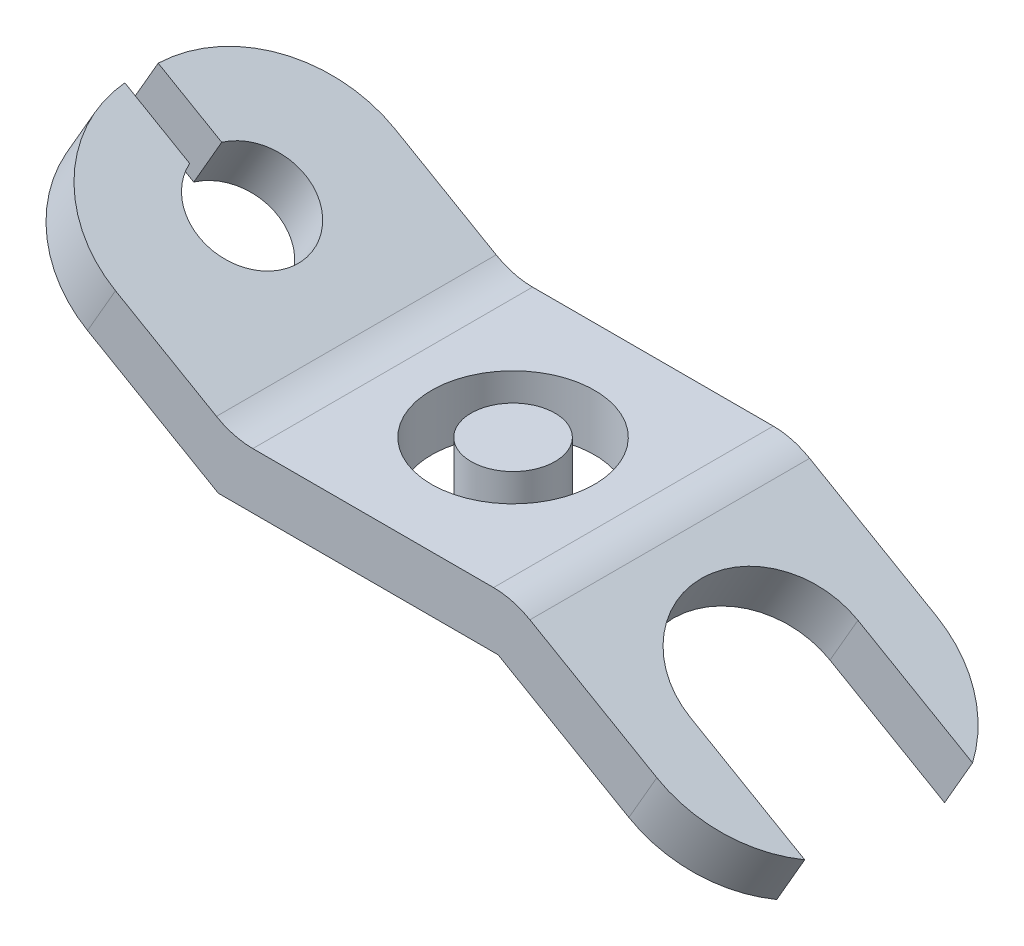
ISO-10303-21;
HEADER;
FILE_DESCRIPTION(('STEP AP214'),'2;1');
FILE_NAME('part.step','',(''),(''),'','','');
FILE_SCHEMA(('AUTOMOTIVE_DESIGN { 1 0 10303 214 1 1 1 1 }'));
ENDSEC;
DATA;
#1=APPLICATION_CONTEXT('core data for automotive mechanical design processes');
#2=APPLICATION_PROTOCOL_DEFINITION('international standard','automotive_design',2000,#1);
#3=PRODUCT_CONTEXT('',#1,'mechanical');
#4=PRODUCT('Part','Part','',(#3));
#5=PRODUCT_RELATED_PRODUCT_CATEGORY('part','',(#4));
#6=PRODUCT_DEFINITION_FORMATION('','',#4);
#7=PRODUCT_DEFINITION_CONTEXT('part definition',#1,'design');
#8=PRODUCT_DEFINITION('design','',#6,#7);
#9=PRODUCT_DEFINITION_SHAPE('','',#8);
#10=(LENGTH_UNIT() NAMED_UNIT(*) SI_UNIT(.MILLI.,.METRE.));
#11=(NAMED_UNIT(*) PLANE_ANGLE_UNIT() SI_UNIT($,.RADIAN.));
#12=(NAMED_UNIT(*) SI_UNIT($,.STERADIAN.) SOLID_ANGLE_UNIT());
#13=UNCERTAINTY_MEASURE_WITH_UNIT(LENGTH_MEASURE(1.E-05),#10,'distance_accuracy_value','');
#14=(GEOMETRIC_REPRESENTATION_CONTEXT(3) GLOBAL_UNCERTAINTY_ASSIGNED_CONTEXT((#13)) GLOBAL_UNIT_ASSIGNED_CONTEXT((#10,
#11,#12)) REPRESENTATION_CONTEXT('',''));
#15=CARTESIAN_POINT('',(0.,0.,0.));
#16=DIRECTION('',(0.,0.,1.));
#17=DIRECTION('',(1.,0.,0.));
#18=AXIS2_PLACEMENT_3D('',#15,#16,#17);
#19=CARTESIAN_POINT('',(4.99999999999995,8.66025403784442,50.));
#20=DIRECTION('',(-0.499999999999995,-0.866025403784442,0.));
#21=DIRECTION('',(0.866025403784442,-0.499999999999995,0.));
#22=AXIS2_PLACEMENT_3D('',#19,#20,#21);
#23=PLANE('',#22);
#24=DIRECTION('',(-0.866025403784442,0.499999999999995,0.));
#25=VECTOR('',#24,1.);
#26=CARTESIAN_POINT('',(4.99999999999995,8.66025403784442,50.));
#27=LINE('',#26,#25);
#28=CARTESIAN_POINT('',(-0.337168574084188,11.7416697508023,50.));
#29=VERTEX_POINT('',#28);
#30=CARTESIAN_POINT('',(-18.38268590218,22.1602540378443,50.));
#31=VERTEX_POINT('',#30);
#32=EDGE_CURVE('E250',#29,#31,#27,.T.);
#33=ORIENTED_EDGE('',*,*,#32,.F.);
#34=DIRECTION('',(0.,0.,-1.));
#35=VECTOR('',#34,1.);
#36=CARTESIAN_POINT('',(-0.337168574084185,11.7416697508023,0.));
#37=LINE('',#36,#35);
#38=CARTESIAN_POINT('',(-0.337168574084188,11.7416697508023,0.));
#39=VERTEX_POINT('',#38);
#40=EDGE_CURVE('E385',#29,#39,#37,.T.);
#41=ORIENTED_EDGE('',*,*,#40,.T.);
#42=DIRECTION('',(-0.866025403784442,0.499999999999995,0.));
#43=VECTOR('',#42,1.);
#44=CARTESIAN_POINT('',(4.99999999999995,8.66025403784442,0.));
#45=LINE('',#44,#43);
#46=CARTESIAN_POINT('',(-18.38268590218,22.1602540378443,0.));
#47=VERTEX_POINT('',#46);
#48=EDGE_CURVE('E265',#39,#47,#45,.T.);
#49=ORIENTED_EDGE('',*,*,#48,.T.);
#50=CARTESIAN_POINT('',(-18.38268590218,22.1602540378443,23.));
#51=DIRECTION('',(-0.499999999999995,-0.866025403784442,0.));
#52=DIRECTION('',(0.866025403784442,-0.499999999999995,0.));
#53=AXIS2_PLACEMENT_3D('',#50,#51,#52);
#54=CIRCLE('',#53,23.);
#55=CARTESIAN_POINT('',(-38.295692303261,33.657033643883,22.4557254730551));
#56=VERTEX_POINT('',#55);
#57=EDGE_CURVE('E261',#47,#56,#54,.F.);
#58=ORIENTED_EDGE('',*,*,#57,.T.);
#59=DIRECTION('',(-0.866025403784442,0.499999999999995,0.));
#60=VECTOR('',#59,1.);
#61=CARTESIAN_POINT('',(4.99999999999995,8.66025403784441,22.4557254730551));
#62=LINE('',#61,#60);
#63=CARTESIAN_POINT('',(-26.9356186363038,27.0982920542514,22.4557254730551));
#64=VERTEX_POINT('',#63);
#65=EDGE_CURVE('E321',#64,#56,#62,.T.);
#66=ORIENTED_EDGE('',*,*,#65,.F.);
#67=CARTESIAN_POINT('',(-18.9711431702999,22.4999999999999,25.));
#68=DIRECTION('',(0.499999999999995,0.866025403784442,0.));
#69=DIRECTION('',(-0.866025403784442,0.499999999999995,0.));
#70=AXIS2_PLACEMENT_3D('',#67,#68,#69);
#71=CIRCLE('',#70,9.54203815404409);
#72=CARTESIAN_POINT('',(-26.6738271305233,26.9471466579174,28.4557254730551));
#73=VERTEX_POINT('',#72);
#74=EDGE_CURVE('E316',#73,#64,#71,.T.);
#75=ORIENTED_EDGE('',*,*,#74,.F.);
#76=DIRECTION('',(-0.866025403784442,0.499999999999995,0.));
#77=VECTOR('',#76,1.);
#78=CARTESIAN_POINT('',(4.99999999999995,8.66025403784441,28.4557254730551));
#79=LINE('',#78,#77);
#80=CARTESIAN_POINT('',(-38.2613339324241,33.6371968292314,28.4557254730551));
#81=VERTEX_POINT('',#80);
#82=EDGE_CURVE('E270',#73,#81,#79,.T.);
#83=ORIENTED_EDGE('',*,*,#82,.T.);
#84=CARTESIAN_POINT('',(-18.38268590218,22.1602540378443,27.));
#85=DIRECTION('',(-0.499999999999995,-0.866025403784442,0.));
#86=DIRECTION('',(0.866025403784442,-0.499999999999995,0.));
#87=AXIS2_PLACEMENT_3D('',#84,#85,#86);
#88=CIRCLE('',#87,23.);
#89=EDGE_CURVE('E266',#81,#31,#88,.F.);
#90=ORIENTED_EDGE('',*,*,#89,.T.);
#91=EDGE_LOOP('',(#33,#41,#49,#58,#66,#75,#83,#90));
#92=FACE_BOUND('',#91,.T.);
#93=ADVANCED_FACE('F68',(#92),#23,.F.);
#94=CARTESIAN_POINT('',(0.,0.,50.));
#95=DIRECTION('',(-0.499999999999995,-0.866025403784442,0.));
#96=DIRECTION('',(0.866025403784442,-0.499999999999995,0.));
#97=AXIS2_PLACEMENT_3D('',#94,#95,#96);
#98=PLANE('',#97);
#99=CARTESIAN_POINT('',(-23.3826859021799,13.4999999999999,27.));
#100=DIRECTION('',(-0.499999999999995,-0.866025403784442,0.));
#101=DIRECTION('',(0.866025403784442,-0.499999999999995,0.));
#102=AXIS2_PLACEMENT_3D('',#99,#100,#101);
#103=CIRCLE('',#102,23.);
#104=CARTESIAN_POINT('',(-23.3826859021799,13.4999999999999,50.));
#105=VERTEX_POINT('',#104);
#106=CARTESIAN_POINT('',(-43.261333932424,24.9769427913869,28.4557254730551));
#107=VERTEX_POINT('',#106);
#108=EDGE_CURVE('E256',#105,#107,#103,.T.);
#109=ORIENTED_EDGE('',*,*,#108,.T.);
#110=DIRECTION('',(-0.866025403784442,0.499999999999995,0.));
#111=VECTOR('',#110,1.);
#112=CARTESIAN_POINT('',(0.,0.,28.4557254730551));
#113=LINE('',#112,#111);
#114=CARTESIAN_POINT('',(-31.6738271305233,18.286892620073,28.4557254730551));
#115=VERTEX_POINT('',#114);
#116=EDGE_CURVE('E315',#115,#107,#113,.T.);
#117=ORIENTED_EDGE('',*,*,#116,.F.);
#118=CARTESIAN_POINT('',(-23.9711431702998,13.8397459621554,25.));
#119=DIRECTION('',(0.499999999999995,0.866025403784442,0.));
#120=DIRECTION('',(-0.866025403784442,0.499999999999995,0.));
#121=AXIS2_PLACEMENT_3D('',#118,#119,#120);
#122=CIRCLE('',#121,9.54203815404409);
#123=CARTESIAN_POINT('',(-31.9356186363038,18.438038016407,22.4557254730551));
#124=VERTEX_POINT('',#123);
#125=EDGE_CURVE('E260',#115,#124,#122,.T.);
#126=ORIENTED_EDGE('',*,*,#125,.T.);
#127=DIRECTION('',(-0.866025403784442,0.499999999999995,0.));
#128=VECTOR('',#127,1.);
#129=CARTESIAN_POINT('',(0.,0.,22.4557254730551));
#130=LINE('',#129,#128);
#131=CARTESIAN_POINT('',(-43.2956923032609,24.9967796060385,22.4557254730551));
#132=VERTEX_POINT('',#131);
#133=EDGE_CURVE('E255',#124,#132,#130,.T.);
#134=ORIENTED_EDGE('',*,*,#133,.T.);
#135=CARTESIAN_POINT('',(-23.3826859021799,13.4999999999999,23.));
#136=DIRECTION('',(-0.499999999999995,-0.866025403784442,0.));
#137=DIRECTION('',(0.866025403784442,-0.499999999999995,0.));
#138=AXIS2_PLACEMENT_3D('',#135,#136,#137);
#139=CIRCLE('',#138,23.);
#140=CARTESIAN_POINT('',(-23.3826859021799,13.4999999999999,0.));
#141=VERTEX_POINT('',#140);
#142=EDGE_CURVE('E251',#132,#141,#139,.T.);
#143=ORIENTED_EDGE('',*,*,#142,.T.);
#144=DIRECTION('',(-0.866025403784442,0.499999999999995,0.));
#145=VECTOR('',#144,1.);
#146=CARTESIAN_POINT('',(0.,0.,0.));
#147=LINE('',#146,#145);
#148=CARTESIAN_POINT('',(0.,0.,0.));
#149=VERTEX_POINT('',#148);
#150=EDGE_CURVE('E276',#149,#141,#147,.T.);
#151=ORIENTED_EDGE('',*,*,#150,.F.);
#152=DIRECTION('',(0.,0.,-1.));
#153=VECTOR('',#152,1.);
#154=CARTESIAN_POINT('',(0.,0.,50.));
#155=LINE('',#154,#153);
#156=CARTESIAN_POINT('',(0.,0.,50.));
#157=VERTEX_POINT('',#156);
#158=EDGE_CURVE('E277',#157,#149,#155,.T.);
#159=ORIENTED_EDGE('',*,*,#158,.F.);
#160=DIRECTION('',(-0.866025403784442,0.499999999999995,0.));
#161=VECTOR('',#160,1.);
#162=CARTESIAN_POINT('',(0.,0.,50.));
#163=LINE('',#162,#161);
#164=EDGE_CURVE('E254',#157,#105,#163,.T.);
#165=ORIENTED_EDGE('',*,*,#164,.T.);
#166=EDGE_LOOP('',(#109,#117,#126,#134,#143,#151,#159,#165));
#167=FACE_BOUND('',#166,.T.);
#168=ADVANCED_FACE('F410',(#167),#98,.T.);
#169=CARTESIAN_POINT('',(-23.3826859021799,13.4999999999999,27.));
#170=DIRECTION('',(-0.499999999999994,-0.866025403784442,0.));
#171=DIRECTION('',(0.866025403784442,-0.499999999999994,0.));
#172=AXIS2_PLACEMENT_3D('',#169,#170,#171);
#173=CYLINDRICAL_SURFACE('',#172,23.);
#174=ORIENTED_EDGE('',*,*,#89,.F.);
#175=DIRECTION('',(0.499999999999995,0.866025403784442,0.));
#176=VECTOR('',#175,1.);
#177=CARTESIAN_POINT('',(-43.261333932424,24.9769427913869,28.4557254730551));
#178=LINE('',#177,#176);
#179=EDGE_CURVE('E325',#107,#81,#178,.T.);
#180=ORIENTED_EDGE('',*,*,#179,.F.);
#181=ORIENTED_EDGE('',*,*,#108,.F.);
#182=DIRECTION('',(0.499999999999994,0.866025403784442,0.));
#183=VECTOR('',#182,1.);
#184=CARTESIAN_POINT('',(-23.3826859021799,13.4999999999999,50.));
#185=LINE('',#184,#183);
#186=EDGE_CURVE('E247',#31,#105,#185,.F.);
#187=ORIENTED_EDGE('',*,*,#186,.F.);
#188=EDGE_LOOP('',(#174,#180,#181,#187));
#189=FACE_BOUND('',#188,.T.);
#190=ADVANCED_FACE('F414',(#189),#173,.T.);
#191=CARTESIAN_POINT('',(0.,0.,50.));
#192=DIRECTION('',(0.,-1.,0.));
#193=DIRECTION('',(0.,0.,-1.));
#194=AXIS2_PLACEMENT_3D('',#191,#192,#193);
#195=PLANE('',#194);
#196=CARTESIAN_POINT('',(27.6794919243112,0.,25.));
#197=DIRECTION('',(0.,1.,0.));
#198=DIRECTION('',(0.,0.,1.));
#199=AXIS2_PLACEMENT_3D('',#196,#197,#198);
#200=CIRCLE('',#199,14.5725064696315);
#201=CARTESIAN_POINT('',(27.6794919243112,0.,39.5725064696315));
#202=VERTEX_POINT('',#201);
#203=EDGE_CURVE('E306',#202,#202,#200,.T.);
#204=ORIENTED_EDGE('',*,*,#203,.T.);
#205=EDGE_LOOP('',(#204));
#206=FACE_BOUND('',#205,.T.);
#207=DIRECTION('',(-1.,0.,0.));
#208=VECTOR('',#207,1.);
#209=CARTESIAN_POINT('',(0.,0.,0.));
#210=LINE('',#209,#208);
#211=CARTESIAN_POINT('',(50.,0.,0.));
#212=VERTEX_POINT('',#211);
#213=EDGE_CURVE('E287',#212,#149,#210,.T.);
#214=ORIENTED_EDGE('',*,*,#213,.F.);
#215=DIRECTION('',(0.,0.,-1.));
#216=VECTOR('',#215,1.);
#217=CARTESIAN_POINT('',(50.,0.,50.));
#218=LINE('',#217,#216);
#219=CARTESIAN_POINT('',(50.,0.,50.));
#220=VERTEX_POINT('',#219);
#221=EDGE_CURVE('E237',#220,#212,#218,.T.);
#222=ORIENTED_EDGE('',*,*,#221,.F.);
#223=DIRECTION('',(-1.,0.,0.));
#224=VECTOR('',#223,1.);
#225=CARTESIAN_POINT('',(0.,0.,50.));
#226=LINE('',#225,#224);
#227=EDGE_CURVE('E281',#220,#157,#226,.T.);
#228=ORIENTED_EDGE('',*,*,#227,.T.);
#229=ORIENTED_EDGE('',*,*,#158,.T.);
#230=EDGE_LOOP('',(#214,#222,#228,#229));
#231=FACE_BOUND('',#230,.T.);
#232=ADVANCED_FACE('F433',(#206,#231),#195,.T.);
#233=CARTESIAN_POINT('',(50.,0.,50.));
#234=DIRECTION('',(-0.500000000000001,-0.866025403784438,0.));
#235=DIRECTION('',(0.866025403784438,-0.500000000000001,0.));
#236=AXIS2_PLACEMENT_3D('',#233,#234,#235);
#237=PLANE('',#236);
#238=DIRECTION('',(-0.866025403784438,0.500000000000001,0.));
#239=VECTOR('',#238,1.);
#240=CARTESIAN_POINT('',(69.3301270189222,-11.1602540378444,10.));
#241=LINE('',#240,#239);
#242=CARTESIAN_POINT('',(89.8143626273348,-22.9868329805052,10.));
#243=VERTEX_POINT('',#242);
#244=CARTESIAN_POINT('',(69.3301270189222,-11.1602540378444,10.));
#245=VERTEX_POINT('',#244);
#246=EDGE_CURVE('E280',#243,#245,#241,.T.);
#247=ORIENTED_EDGE('',*,*,#246,.T.);
#248=CARTESIAN_POINT('',(69.3301270189222,-11.1602540378444,25.));
#249=DIRECTION('',(0.500000000000001,0.866025403784438,0.));
#250=DIRECTION('',(-0.866025403784438,0.500000000000001,0.));
#251=AXIS2_PLACEMENT_3D('',#248,#249,#250);
#252=CIRCLE('',#251,15.);
#253=CARTESIAN_POINT('',(69.3301270189222,-11.1602540378444,40.));
#254=VERTEX_POINT('',#253);
#255=EDGE_CURVE('E358',#245,#254,#252,.T.);
#256=ORIENTED_EDGE('',*,*,#255,.T.);
#257=DIRECTION('',(0.866025403784438,-0.500000000000001,0.));
#258=VECTOR('',#257,1.);
#259=CARTESIAN_POINT('',(69.3301270189222,-11.1602540378444,40.));
#260=LINE('',#259,#258);
#261=CARTESIAN_POINT('',(89.8143626273348,-22.9868329805052,40.));
#262=VERTEX_POINT('',#261);
#263=EDGE_CURVE('E241',#254,#262,#260,.T.);
#264=ORIENTED_EDGE('',*,*,#263,.T.);
#265=CARTESIAN_POINT('',(73.3826859021798,-13.5,27.));
#266=DIRECTION('',(-0.500000000000001,-0.866025403784438,0.));
#267=DIRECTION('',(0.866025403784438,-0.500000000000001,0.));
#268=AXIS2_PLACEMENT_3D('',#265,#266,#267);
#269=CIRCLE('',#268,23.);
#270=CARTESIAN_POINT('',(73.3826859021798,-13.5,50.));
#271=VERTEX_POINT('',#270);
#272=EDGE_CURVE('E213',#262,#271,#269,.T.);
#273=ORIENTED_EDGE('',*,*,#272,.T.);
#274=DIRECTION('',(-0.866025403784438,0.500000000000001,0.));
#275=VECTOR('',#274,1.);
#276=CARTESIAN_POINT('',(50.,0.,50.));
#277=LINE('',#276,#275);
#278=EDGE_CURVE('E240',#271,#220,#277,.T.);
#279=ORIENTED_EDGE('',*,*,#278,.T.);
#280=ORIENTED_EDGE('',*,*,#221,.T.);
#281=DIRECTION('',(-0.866025403784438,0.500000000000001,0.));
#282=VECTOR('',#281,1.);
#283=CARTESIAN_POINT('',(50.,0.,0.));
#284=LINE('',#283,#282);
#285=CARTESIAN_POINT('',(73.3826859021798,-13.5,0.));
#286=VERTEX_POINT('',#285);
#287=EDGE_CURVE('E246',#286,#212,#284,.T.);
#288=ORIENTED_EDGE('',*,*,#287,.F.);
#289=CARTESIAN_POINT('',(73.3826859021798,-13.5,23.));
#290=DIRECTION('',(-0.500000000000001,-0.866025403784438,0.));
#291=DIRECTION('',(0.866025403784438,-0.500000000000001,0.));
#292=AXIS2_PLACEMENT_3D('',#289,#290,#291);
#293=CIRCLE('',#292,23.);
#294=EDGE_CURVE('E233',#286,#243,#293,.T.);
#295=ORIENTED_EDGE('',*,*,#294,.T.);
#296=EDGE_LOOP('',(#247,#256,#264,#273,#279,#280,#288,#295));
#297=FACE_BOUND('',#296,.T.);
#298=ADVANCED_FACE('F449',(#297),#237,.T.);
#299=CARTESIAN_POINT('',(55.,8.66025403784438,50.));
#300=DIRECTION('',(-0.500000000000001,-0.866025403784438,0.));
#301=DIRECTION('',(0.866025403784438,-0.500000000000001,0.));
#302=AXIS2_PLACEMENT_3D('',#299,#300,#301);
#303=PLANE('',#302);
#304=DIRECTION('',(-0.866025403784438,0.500000000000001,0.));
#305=VECTOR('',#304,1.);
#306=CARTESIAN_POINT('',(55.,8.66025403784438,0.));
#307=LINE('',#306,#305);
#308=CARTESIAN_POINT('',(78.3826859021799,-4.83974596215566,0.));
#309=VERTEX_POINT('',#308);
#310=CARTESIAN_POINT('',(55.6961524227066,8.25833024919769,0.));
#311=VERTEX_POINT('',#310);
#312=EDGE_CURVE('E221',#309,#311,#307,.T.);
#313=ORIENTED_EDGE('',*,*,#312,.T.);
#314=DIRECTION('',(0.,0.,-1.));
#315=VECTOR('',#314,1.);
#316=CARTESIAN_POINT('',(55.6961524227066,8.25833024919769,50.));
#317=LINE('',#316,#315);
#318=CARTESIAN_POINT('',(55.6961524227066,8.25833024919769,50.));
#319=VERTEX_POINT('',#318);
#320=EDGE_CURVE('E90',#311,#319,#317,.F.);
#321=ORIENTED_EDGE('',*,*,#320,.T.);
#322=DIRECTION('',(-0.866025403784438,0.500000000000001,0.));
#323=VECTOR('',#322,1.);
#324=CARTESIAN_POINT('',(55.,8.66025403784438,50.));
#325=LINE('',#324,#323);
#326=CARTESIAN_POINT('',(78.3826859021799,-4.83974596215567,50.));
#327=VERTEX_POINT('',#326);
#328=EDGE_CURVE('E218',#327,#319,#325,.T.);
#329=ORIENTED_EDGE('',*,*,#328,.F.);
#330=CARTESIAN_POINT('',(78.3826859021799,-4.83974596215566,27.));
#331=DIRECTION('',(-0.500000000000001,-0.866025403784438,0.));
#332=DIRECTION('',(0.866025403784438,-0.500000000000001,0.));
#333=AXIS2_PLACEMENT_3D('',#330,#331,#332);
#334=CIRCLE('',#333,23.);
#335=CARTESIAN_POINT('',(94.8143626273348,-14.3265789426608,40.));
#336=VERTEX_POINT('',#335);
#337=EDGE_CURVE('E212',#327,#336,#334,.F.);
#338=ORIENTED_EDGE('',*,*,#337,.T.);
#339=DIRECTION('',(0.866025403784438,-0.500000000000001,0.));
#340=VECTOR('',#339,1.);
#341=CARTESIAN_POINT('',(74.3301270189222,-2.50000000000001,40.));
#342=LINE('',#341,#340);
#343=CARTESIAN_POINT('',(74.3301270189222,-2.50000000000001,40.));
#344=VERTEX_POINT('',#343);
#345=EDGE_CURVE('E194',#344,#336,#342,.T.);
#346=ORIENTED_EDGE('',*,*,#345,.F.);
#347=CARTESIAN_POINT('',(74.3301270189222,-2.50000000000001,25.));
#348=DIRECTION('',(0.500000000000001,0.866025403784438,0.));
#349=DIRECTION('',(-0.866025403784438,0.500000000000001,0.));
#350=AXIS2_PLACEMENT_3D('',#347,#348,#349);
#351=CIRCLE('',#350,15.);
#352=CARTESIAN_POINT('',(74.3301270189222,-2.50000000000001,10.));
#353=VERTEX_POINT('',#352);
#354=EDGE_CURVE('E320',#353,#344,#351,.T.);
#355=ORIENTED_EDGE('',*,*,#354,.F.);
#356=DIRECTION('',(-0.866025403784438,0.500000000000001,0.));
#357=VECTOR('',#356,1.);
#358=CARTESIAN_POINT('',(74.3301270189222,-2.50000000000001,10.));
#359=LINE('',#358,#357);
#360=CARTESIAN_POINT('',(94.8143626273348,-14.3265789426608,10.));
#361=VERTEX_POINT('',#360);
#362=EDGE_CURVE('E215',#361,#353,#359,.T.);
#363=ORIENTED_EDGE('',*,*,#362,.F.);
#364=CARTESIAN_POINT('',(78.3826859021799,-4.83974596215566,23.));
#365=DIRECTION('',(-0.500000000000001,-0.866025403784438,0.));
#366=DIRECTION('',(0.866025403784438,-0.500000000000001,0.));
#367=AXIS2_PLACEMENT_3D('',#364,#365,#366);
#368=CIRCLE('',#367,23.);
#369=EDGE_CURVE('E228',#361,#309,#368,.F.);
#370=ORIENTED_EDGE('',*,*,#369,.T.);
#371=EDGE_LOOP('',(#313,#321,#329,#338,#346,#355,#363,#370));
#372=FACE_BOUND('',#371,.T.);
#373=ADVANCED_FACE('F217',(#372),#303,.F.);
#374=CARTESIAN_POINT('',(0.,10.,50.));
#375=DIRECTION('',(0.,-1.,0.));
#376=DIRECTION('',(0.,0.,-1.));
#377=AXIS2_PLACEMENT_3D('',#374,#375,#376);
#378=PLANE('',#377);
#379=CARTESIAN_POINT('',(27.6794919243112,10.,25.));
#380=DIRECTION('',(0.,1.,0.));
#381=DIRECTION('',(0.,0.,1.));
#382=AXIS2_PLACEMENT_3D('',#379,#380,#381);
#383=CIRCLE('',#382,14.5725064696315);
#384=CARTESIAN_POINT('',(27.6794919243112,10.,39.5725064696315));
#385=VERTEX_POINT('',#384);
#386=EDGE_CURVE('E205',#385,#385,#383,.T.);
#387=ORIENTED_EDGE('',*,*,#386,.F.);
#388=EDGE_LOOP('',(#387));
#389=FACE_BOUND('',#388,.T.);
#390=DIRECTION('',(1.,0.,0.));
#391=VECTOR('',#390,1.);
#392=CARTESIAN_POINT('',(0.,10.,50.));
#393=LINE('',#392,#391);
#394=CARTESIAN_POINT('',(49.1961524227066,10.,50.));
#395=VERTEX_POINT('',#394);
#396=CARTESIAN_POINT('',(6.16283142591574,10.,50.));
#397=VERTEX_POINT('',#396);
#398=EDGE_CURVE('E296',#395,#397,#393,.F.);
#399=ORIENTED_EDGE('',*,*,#398,.F.);
#400=DIRECTION('',(0.,0.,-1.));
#401=VECTOR('',#400,1.);
#402=CARTESIAN_POINT('',(49.1961524227066,10.,50.));
#403=LINE('',#402,#401);
#404=CARTESIAN_POINT('',(49.1961524227066,10.,0.));
#405=VERTEX_POINT('',#404);
#406=EDGE_CURVE('E373',#395,#405,#403,.T.);
#407=ORIENTED_EDGE('',*,*,#406,.T.);
#408=DIRECTION('',(1.,0.,0.));
#409=VECTOR('',#408,1.);
#410=CARTESIAN_POINT('',(0.,10.,0.));
#411=LINE('',#410,#409);
#412=CARTESIAN_POINT('',(6.16283142591574,10.,0.));
#413=VERTEX_POINT('',#412);
#414=EDGE_CURVE('E220',#405,#413,#411,.F.);
#415=ORIENTED_EDGE('',*,*,#414,.T.);
#416=DIRECTION('',(0.,0.,-1.));
#417=VECTOR('',#416,1.);
#418=CARTESIAN_POINT('',(6.16283142591574,10.,50.));
#419=LINE('',#418,#417);
#420=EDGE_CURVE('E367',#413,#397,#419,.F.);
#421=ORIENTED_EDGE('',*,*,#420,.T.);
#422=EDGE_LOOP('',(#399,#407,#415,#421));
#423=FACE_BOUND('',#422,.T.);
#424=ADVANCED_FACE('F398',(#389,#423),#378,.F.);
#425=CARTESIAN_POINT('',(0.,0.,50.));
#426=DIRECTION('',(0.,0.,-1.));
#427=DIRECTION('',(-1.,0.,0.));
#428=AXIS2_PLACEMENT_3D('',#425,#426,#427);
#429=PLANE('',#428);
#430=ORIENTED_EDGE('',*,*,#328,.T.);
#431=CARTESIAN_POINT('',(49.1961524227066,-3.,50.));
#432=DIRECTION('',(0.,0.,-1.));
#433=DIRECTION('',(-1.,0.,0.));
#434=AXIS2_PLACEMENT_3D('',#431,#432,#433);
#435=CIRCLE('',#434,13.);
#436=EDGE_CURVE('E382',#319,#395,#435,.F.);
#437=ORIENTED_EDGE('',*,*,#436,.T.);
#438=ORIENTED_EDGE('',*,*,#398,.T.);
#439=CARTESIAN_POINT('',(6.16283142591574,23.,50.));
#440=DIRECTION('',(0.,0.,-1.));
#441=DIRECTION('',(-1.,0.,0.));
#442=AXIS2_PLACEMENT_3D('',#439,#440,#441);
#443=CIRCLE('',#442,13.);
#444=EDGE_CURVE('E13',#397,#29,#443,.T.);
#445=ORIENTED_EDGE('',*,*,#444,.T.);
#446=ORIENTED_EDGE('',*,*,#32,.T.);
#447=ORIENTED_EDGE('',*,*,#186,.T.);
#448=ORIENTED_EDGE('',*,*,#164,.F.);
#449=ORIENTED_EDGE('',*,*,#227,.F.);
#450=ORIENTED_EDGE('',*,*,#278,.F.);
#451=DIRECTION('',(-0.500000000000003,-0.866025403784437,0.));
#452=VECTOR('',#451,1.);
#453=CARTESIAN_POINT('',(78.3826859021799,-4.83974596215562,50.));
#454=LINE('',#453,#452);
#455=EDGE_CURVE('E226',#271,#327,#454,.F.);
#456=ORIENTED_EDGE('',*,*,#455,.T.);
#457=EDGE_LOOP('',(#430,#437,#438,#445,#446,#447,#448,#449,#450,#456));
#458=FACE_BOUND('',#457,.T.);
#459=ADVANCED_FACE('F404',(#458),#429,.F.);
#460=CARTESIAN_POINT('',(0.,0.,0.));
#461=DIRECTION('',(0.,0.,-1.));
#462=DIRECTION('',(-1.,0.,0.));
#463=AXIS2_PLACEMENT_3D('',#460,#461,#462);
#464=PLANE('',#463);
#465=ORIENTED_EDGE('',*,*,#414,.F.);
#466=CARTESIAN_POINT('',(49.1961524227066,-3.,0.));
#467=DIRECTION('',(0.,0.,-1.));
#468=DIRECTION('',(-1.,0.,0.));
#469=AXIS2_PLACEMENT_3D('',#466,#467,#468);
#470=CIRCLE('',#469,13.);
#471=EDGE_CURVE('E377',#405,#311,#470,.T.);
#472=ORIENTED_EDGE('',*,*,#471,.T.);
#473=ORIENTED_EDGE('',*,*,#312,.F.);
#474=DIRECTION('',(-0.500000000000003,-0.866025403784437,0.));
#475=VECTOR('',#474,1.);
#476=CARTESIAN_POINT('',(60.8826859021797,-35.1506350946111,0.));
#477=LINE('',#476,#475);
#478=EDGE_CURVE('E242',#309,#286,#477,.T.);
#479=ORIENTED_EDGE('',*,*,#478,.T.);
#480=ORIENTED_EDGE('',*,*,#287,.T.);
#481=ORIENTED_EDGE('',*,*,#213,.T.);
#482=ORIENTED_EDGE('',*,*,#150,.T.);
#483=DIRECTION('',(0.499999999999994,0.866025403784442,0.));
#484=VECTOR('',#483,1.);
#485=CARTESIAN_POINT('',(-23.3826859021799,13.4999999999998,0.));
#486=LINE('',#485,#484);
#487=EDGE_CURVE('E271',#141,#47,#486,.T.);
#488=ORIENTED_EDGE('',*,*,#487,.T.);
#489=ORIENTED_EDGE('',*,*,#48,.F.);
#490=CARTESIAN_POINT('',(6.16283142591574,23.,0.));
#491=DIRECTION('',(0.,0.,-1.));
#492=DIRECTION('',(-1.,0.,0.));
#493=AXIS2_PLACEMENT_3D('',#490,#491,#492);
#494=CIRCLE('',#493,13.);
#495=EDGE_CURVE('E77',#39,#413,#494,.F.);
#496=ORIENTED_EDGE('',*,*,#495,.T.);
#497=EDGE_LOOP('',(#465,#472,#473,#479,#480,#481,#482,#488,#489,#496));
#498=FACE_BOUND('',#497,.T.);
#499=ADVANCED_FACE('F392',(#498),#464,.T.);
#500=CARTESIAN_POINT('',(-23.3826859021799,13.4999999999998,23.));
#501=DIRECTION('',(0.499999999999994,0.866025403784442,0.));
#502=DIRECTION('',(-0.866025403784442,0.499999999999994,0.));
#503=AXIS2_PLACEMENT_3D('',#500,#501,#502);
#504=CYLINDRICAL_SURFACE('',#503,23.);
#505=DIRECTION('',(0.499999999999995,0.866025403784442,0.));
#506=VECTOR('',#505,1.);
#507=CARTESIAN_POINT('',(-43.2956923032609,24.9967796060385,22.4557254730551));
#508=LINE('',#507,#506);
#509=EDGE_CURVE('E275',#132,#56,#508,.T.);
#510=ORIENTED_EDGE('',*,*,#509,.T.);
#511=ORIENTED_EDGE('',*,*,#57,.F.);
#512=ORIENTED_EDGE('',*,*,#487,.F.);
#513=ORIENTED_EDGE('',*,*,#142,.F.);
#514=EDGE_LOOP('',(#510,#511,#512,#513));
#515=FACE_BOUND('',#514,.T.);
#516=ADVANCED_FACE('F428',(#515),#504,.T.);
#517=CARTESIAN_POINT('',(-23.9711431702998,13.8397459621554,25.));
#518=DIRECTION('',(0.499999999999995,0.866025403784442,0.));
#519=DIRECTION('',(-0.866025403784442,0.499999999999995,0.));
#520=AXIS2_PLACEMENT_3D('',#517,#518,#519);
#521=CYLINDRICAL_SURFACE('',#520,9.54203815404409);
#522=ORIENTED_EDGE('',*,*,#74,.T.);
#523=DIRECTION('',(0.499999999999995,0.866025403784442,0.));
#524=VECTOR('',#523,1.);
#525=CARTESIAN_POINT('',(-31.9356186363038,18.438038016407,22.4557254730551));
#526=LINE('',#525,#524);
#527=EDGE_CURVE('E317',#124,#64,#526,.T.);
#528=ORIENTED_EDGE('',*,*,#527,.F.);
#529=ORIENTED_EDGE('',*,*,#125,.F.);
#530=DIRECTION('',(0.499999999999995,0.866025403784442,0.));
#531=VECTOR('',#530,1.);
#532=CARTESIAN_POINT('',(-31.6738271305233,18.286892620073,28.4557254730551));
#533=LINE('',#532,#531);
#534=EDGE_CURVE('E312',#115,#73,#533,.T.);
#535=ORIENTED_EDGE('',*,*,#534,.T.);
#536=EDGE_LOOP('',(#522,#528,#529,#535));
#537=FACE_BOUND('',#536,.T.);
#538=ADVANCED_FACE('F421',(#537),#521,.F.);
#539=CARTESIAN_POINT('',(0.,0.,28.4557254730551));
#540=DIRECTION('',(0.,0.,-1.));
#541=DIRECTION('',(-1.,0.,0.));
#542=AXIS2_PLACEMENT_3D('',#539,#540,#541);
#543=PLANE('',#542);
#544=ORIENTED_EDGE('',*,*,#82,.F.);
#545=ORIENTED_EDGE('',*,*,#534,.F.);
#546=ORIENTED_EDGE('',*,*,#116,.T.);
#547=ORIENTED_EDGE('',*,*,#179,.T.);
#548=EDGE_LOOP('',(#544,#545,#546,#547));
#549=FACE_BOUND('',#548,.T.);
#550=ADVANCED_FACE('F417',(#549),#543,.T.);
#551=CARTESIAN_POINT('',(0.,0.,22.4557254730551));
#552=DIRECTION('',(0.,0.,-1.));
#553=DIRECTION('',(-1.,0.,0.));
#554=AXIS2_PLACEMENT_3D('',#551,#552,#553);
#555=PLANE('',#554);
#556=ORIENTED_EDGE('',*,*,#65,.T.);
#557=ORIENTED_EDGE('',*,*,#509,.F.);
#558=ORIENTED_EDGE('',*,*,#133,.F.);
#559=ORIENTED_EDGE('',*,*,#527,.T.);
#560=EDGE_LOOP('',(#556,#557,#558,#559));
#561=FACE_BOUND('',#560,.T.);
#562=ADVANCED_FACE('F482',(#561),#555,.F.);
#563=CARTESIAN_POINT('',(60.8826859021797,-35.1506350946111,23.));
#564=DIRECTION('',(-0.500000000000003,-0.866025403784437,0.));
#565=DIRECTION('',(0.866025403784437,-0.500000000000003,0.));
#566=AXIS2_PLACEMENT_3D('',#563,#564,#565);
#567=CYLINDRICAL_SURFACE('',#566,23.);
#568=DIRECTION('',(-0.500000000000003,-0.866025403784437,0.));
#569=VECTOR('',#568,1.);
#570=CARTESIAN_POINT('',(77.3143626273346,-44.6374680751163,10.));
#571=LINE('',#570,#569);
#572=EDGE_CURVE('E350',#243,#361,#571,.F.);
#573=ORIENTED_EDGE('',*,*,#572,.F.);
#574=ORIENTED_EDGE('',*,*,#294,.F.);
#575=ORIENTED_EDGE('',*,*,#478,.F.);
#576=ORIENTED_EDGE('',*,*,#369,.F.);
#577=EDGE_LOOP('',(#573,#574,#575,#576));
#578=FACE_BOUND('',#577,.T.);
#579=ADVANCED_FACE('F447',(#578),#567,.T.);
#580=CARTESIAN_POINT('',(78.3826859021799,-4.83974596215562,27.));
#581=DIRECTION('',(0.500000000000003,0.866025403784437,0.));
#582=DIRECTION('',(-0.866025403784437,0.500000000000003,0.));
#583=AXIS2_PLACEMENT_3D('',#580,#581,#582);
#584=CYLINDRICAL_SURFACE('',#583,23.);
#585=DIRECTION('',(0.500000000000003,0.866025403784437,0.));
#586=VECTOR('',#585,1.);
#587=CARTESIAN_POINT('',(94.8143626273348,-14.3265789426608,40.));
#588=LINE('',#587,#586);
#589=EDGE_CURVE('E198',#336,#262,#588,.F.);
#590=ORIENTED_EDGE('',*,*,#589,.F.);
#591=ORIENTED_EDGE('',*,*,#337,.F.);
#592=ORIENTED_EDGE('',*,*,#455,.F.);
#593=ORIENTED_EDGE('',*,*,#272,.F.);
#594=EDGE_LOOP('',(#590,#591,#592,#593));
#595=FACE_BOUND('',#594,.T.);
#596=ADVANCED_FACE('F210',(#595),#584,.T.);
#597=CARTESIAN_POINT('',(69.3301270189222,-11.1602540378444,25.));
#598=DIRECTION('',(0.500000000000001,0.866025403784438,0.));
#599=DIRECTION('',(-0.866025403784438,0.500000000000001,0.));
#600=AXIS2_PLACEMENT_3D('',#597,#598,#599);
#601=CYLINDRICAL_SURFACE('',#600,15.);
#602=ORIENTED_EDGE('',*,*,#354,.T.);
#603=DIRECTION('',(0.500000000000001,0.866025403784438,0.));
#604=VECTOR('',#603,1.);
#605=CARTESIAN_POINT('',(69.3301270189222,-11.1602540378444,40.));
#606=LINE('',#605,#604);
#607=EDGE_CURVE('E200',#254,#344,#606,.T.);
#608=ORIENTED_EDGE('',*,*,#607,.F.);
#609=ORIENTED_EDGE('',*,*,#255,.F.);
#610=DIRECTION('',(0.500000000000001,0.866025403784438,0.));
#611=VECTOR('',#610,1.);
#612=CARTESIAN_POINT('',(69.3301270189222,-11.1602540378444,10.));
#613=LINE('',#612,#611);
#614=EDGE_CURVE('E346',#245,#353,#613,.T.);
#615=ORIENTED_EDGE('',*,*,#614,.T.);
#616=EDGE_LOOP('',(#602,#608,#609,#615));
#617=FACE_BOUND('',#616,.T.);
#618=ADVANCED_FACE('F452',(#617),#601,.F.);
#619=CARTESIAN_POINT('',(69.3301270189222,-11.1602540378444,10.));
#620=DIRECTION('',(0.,0.,-1.));
#621=DIRECTION('',(-1.,0.,0.));
#622=AXIS2_PLACEMENT_3D('',#619,#620,#621);
#623=PLANE('',#622);
#624=ORIENTED_EDGE('',*,*,#572,.T.);
#625=ORIENTED_EDGE('',*,*,#362,.T.);
#626=ORIENTED_EDGE('',*,*,#614,.F.);
#627=ORIENTED_EDGE('',*,*,#246,.F.);
#628=EDGE_LOOP('',(#624,#625,#626,#627));
#629=FACE_BOUND('',#628,.T.);
#630=ADVANCED_FACE('F442',(#629),#623,.F.);
#631=CARTESIAN_POINT('',(69.3301270189222,-11.1602540378444,40.));
#632=DIRECTION('',(0.,0.,1.));
#633=DIRECTION('',(1.,0.,0.));
#634=AXIS2_PLACEMENT_3D('',#631,#632,#633);
#635=PLANE('',#634);
#636=ORIENTED_EDGE('',*,*,#589,.T.);
#637=ORIENTED_EDGE('',*,*,#263,.F.);
#638=ORIENTED_EDGE('',*,*,#607,.T.);
#639=ORIENTED_EDGE('',*,*,#345,.T.);
#640=EDGE_LOOP('',(#636,#637,#638,#639));
#641=FACE_BOUND('',#640,.T.);
#642=ADVANCED_FACE('F196',(#641),#635,.F.);
#643=CARTESIAN_POINT('',(27.6794919243112,0.,25.));
#644=DIRECTION('',(0.,1.,0.));
#645=DIRECTION('',(0.,0.,1.));
#646=AXIS2_PLACEMENT_3D('',#643,#644,#645);
#647=CYLINDRICAL_SURFACE('',#646,14.5725064696315);
#648=ORIENTED_EDGE('',*,*,#203,.F.);
#649=EDGE_LOOP('',(#648));
#650=FACE_BOUND('',#649,.T.);
#651=ORIENTED_EDGE('',*,*,#386,.T.);
#652=EDGE_LOOP('',(#651));
#653=FACE_BOUND('',#652,.T.);
#654=ADVANCED_FACE('F503',(#650,#653),#647,.F.);
#655=CARTESIAN_POINT('',(49.1961524227066,-3.,50.));
#656=DIRECTION('',(0.,0.,-1.));
#657=DIRECTION('',(-1.,0.,0.));
#658=AXIS2_PLACEMENT_3D('',#655,#656,#657);
#659=CYLINDRICAL_SURFACE('',#658,13.);
#660=ORIENTED_EDGE('',*,*,#436,.F.);
#661=ORIENTED_EDGE('',*,*,#320,.F.);
#662=ORIENTED_EDGE('',*,*,#471,.F.);
#663=ORIENTED_EDGE('',*,*,#406,.F.);
#664=EDGE_LOOP('',(#660,#661,#662,#663));
#665=FACE_BOUND('',#664,.T.);
#666=ADVANCED_FACE('F501',(#665),#659,.T.);
#667=CARTESIAN_POINT('',(6.16283142591574,23.,50.));
#668=DIRECTION('',(0.,0.,1.));
#669=DIRECTION('',(1.,0.,0.));
#670=AXIS2_PLACEMENT_3D('',#667,#668,#669);
#671=CYLINDRICAL_SURFACE('',#670,13.);
#672=ORIENTED_EDGE('',*,*,#444,.F.);
#673=ORIENTED_EDGE('',*,*,#420,.F.);
#674=ORIENTED_EDGE('',*,*,#495,.F.);
#675=ORIENTED_EDGE('',*,*,#40,.F.);
#676=EDGE_LOOP('',(#672,#673,#674,#675));
#677=FACE_BOUND('',#676,.T.);
#678=ADVANCED_FACE('F70',(#677),#671,.F.);
#679=CLOSED_SHELL('',(#93,#168,#190,#232,#298,#373,#424,#459,#499,#516,#538,#550,#562,#579,#596,
#618,#630,#642,#654,#666,#678));
#680=MANIFOLD_SOLID_BREP('B2',#679);
#681=CARTESIAN_POINT('',(0.,10.,50.));
#682=DIRECTION('',(0.,-1.,0.));
#683=DIRECTION('',(0.,0.,-1.));
#684=AXIS2_PLACEMENT_3D('',#681,#682,#683);
#685=PLANE('',#684);
#686=CARTESIAN_POINT('',(27.6794919243112,10.,25.));
#687=DIRECTION('',(0.,1.,0.));
#688=DIRECTION('',(0.,0.,1.));
#689=AXIS2_PLACEMENT_3D('',#686,#687,#688);
#690=CIRCLE('',#689,7.5);
#691=CARTESIAN_POINT('',(27.6794919243112,10.,32.5));
#692=VERTEX_POINT('',#691);
#693=EDGE_CURVE('E640',#692,#692,#690,.T.);
#694=ORIENTED_EDGE('',*,*,#693,.T.);
#695=EDGE_LOOP('',(#694));
#696=FACE_BOUND('',#695,.T.);
#697=ADVANCED_FACE('F636',(#696),#685,.F.);
#698=CARTESIAN_POINT('',(27.6794919243112,0.,25.));
#699=DIRECTION('',(0.,1.,0.));
#700=DIRECTION('',(0.,0.,1.));
#701=AXIS2_PLACEMENT_3D('',#698,#699,#700);
#702=CYLINDRICAL_SURFACE('',#701,7.5);
#703=CARTESIAN_POINT('',(27.6794919243112,0.,25.));
#704=DIRECTION('',(0.,1.,0.));
#705=DIRECTION('',(0.,0.,1.));
#706=AXIS2_PLACEMENT_3D('',#703,#704,#705);
#707=CIRCLE('',#706,7.5);
#708=CARTESIAN_POINT('',(27.6794919243112,0.,32.5));
#709=VERTEX_POINT('',#708);
#710=EDGE_CURVE('E67',#709,#709,#707,.T.);
#711=ORIENTED_EDGE('',*,*,#710,.T.);
#712=EDGE_LOOP('',(#711));
#713=FACE_BOUND('',#712,.T.);
#714=ORIENTED_EDGE('',*,*,#693,.F.);
#715=EDGE_LOOP('',(#714));
#716=FACE_BOUND('',#715,.T.);
#717=ADVANCED_FACE('F650',(#713,#716),#702,.T.);
#718=CARTESIAN_POINT('',(0.,0.,50.));
#719=DIRECTION('',(0.,-1.,0.));
#720=DIRECTION('',(0.,0.,-1.));
#721=AXIS2_PLACEMENT_3D('',#718,#719,#720);
#722=PLANE('',#721);
#723=ORIENTED_EDGE('',*,*,#710,.F.);
#724=EDGE_LOOP('',(#723));
#725=FACE_BOUND('',#724,.T.);
#726=ADVANCED_FACE('F638',(#725),#722,.T.);
#727=CLOSED_SHELL('',(#697,#717,#726));
#728=MANIFOLD_SOLID_BREP('B7',#727);
#729=ADVANCED_BREP_SHAPE_REPRESENTATION('',(#18,#680,#728),#14);
#730=SHAPE_DEFINITION_REPRESENTATION(#9,#729);
ENDSEC;
END-ISO-10303-21;
